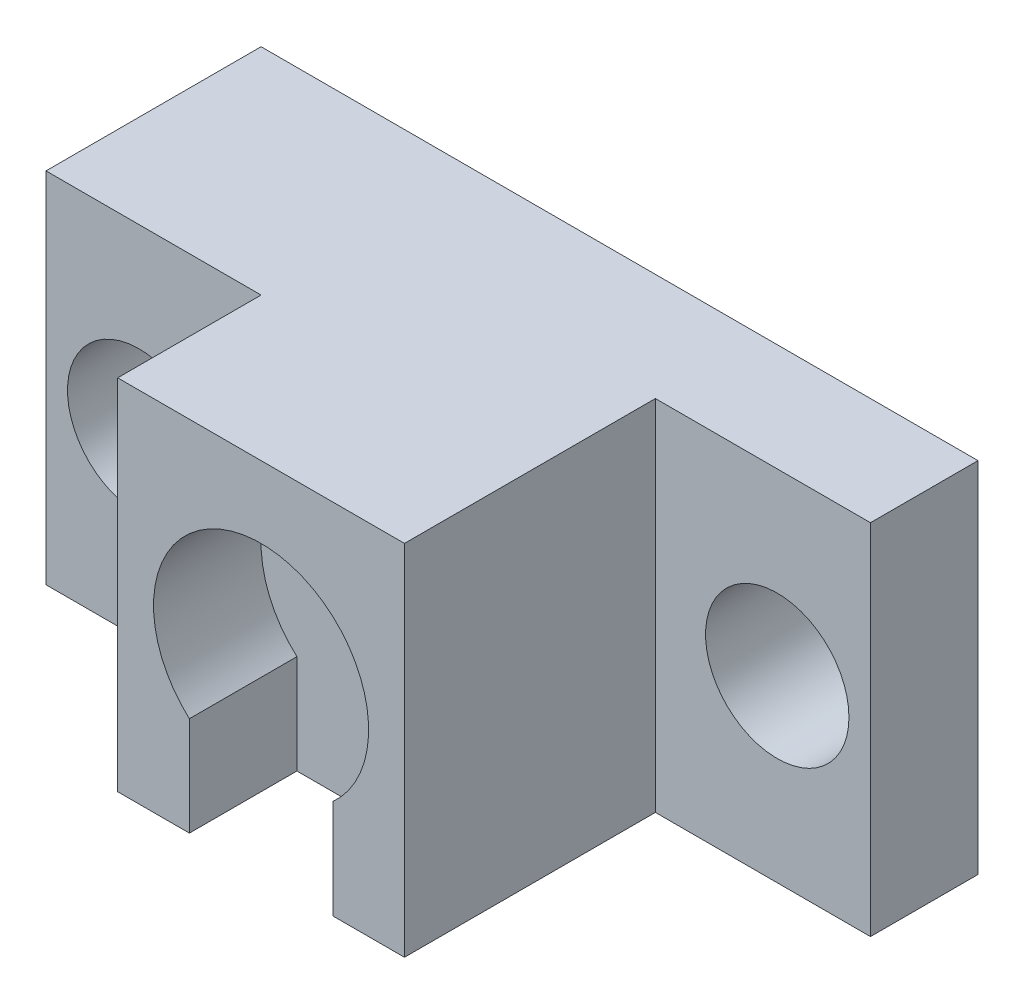
ISO-10303-21;
HEADER;
FILE_DESCRIPTION(('STEP AP214'),'2;1');
FILE_NAME('part.step','',(''),(''),'','','');
FILE_SCHEMA(('AUTOMOTIVE_DESIGN { 1 0 10303 214 1 1 1 1 }'));
ENDSEC;
DATA;
#1=APPLICATION_CONTEXT('core data for automotive mechanical design processes');
#2=APPLICATION_PROTOCOL_DEFINITION('international standard','automotive_design',2000,#1);
#3=PRODUCT_CONTEXT('',#1,'mechanical');
#4=PRODUCT('Part','Part','',(#3));
#5=PRODUCT_RELATED_PRODUCT_CATEGORY('part','',(#4));
#6=PRODUCT_DEFINITION_FORMATION('','',#4);
#7=PRODUCT_DEFINITION_CONTEXT('part definition',#1,'design');
#8=PRODUCT_DEFINITION('design','',#6,#7);
#9=PRODUCT_DEFINITION_SHAPE('','',#8);
#10=(LENGTH_UNIT() NAMED_UNIT(*) SI_UNIT(.MILLI.,.METRE.));
#11=(NAMED_UNIT(*) PLANE_ANGLE_UNIT() SI_UNIT($,.RADIAN.));
#12=(NAMED_UNIT(*) SI_UNIT($,.STERADIAN.) SOLID_ANGLE_UNIT());
#13=UNCERTAINTY_MEASURE_WITH_UNIT(LENGTH_MEASURE(1.E-05),#10,'distance_accuracy_value','');
#14=(GEOMETRIC_REPRESENTATION_CONTEXT(3) GLOBAL_UNCERTAINTY_ASSIGNED_CONTEXT((#13)) GLOBAL_UNIT_ASSIGNED_CONTEXT((#10,
#11,#12)) REPRESENTATION_CONTEXT('',''));
#15=CARTESIAN_POINT('',(0.,0.,0.));
#16=DIRECTION('',(0.,0.,1.));
#17=DIRECTION('',(1.,0.,0.));
#18=AXIS2_PLACEMENT_3D('',#15,#16,#17);
#19=CARTESIAN_POINT('',(0.,9.3607305936073,50.));
#20=DIRECTION('',(0.,1.,0.));
#21=DIRECTION('',(0.,0.,1.));
#22=AXIS2_PLACEMENT_3D('',#19,#20,#21);
#23=PLANE('',#22);
#24=DIRECTION('',(0.,0.,1.));
#25=VECTOR('',#24,1.);
#26=CARTESIAN_POINT('',(10.,9.36073059360731,35.));
#27=LINE('',#26,#25);
#28=CARTESIAN_POINT('',(10.,9.36073059360731,35.));
#29=VERTEX_POINT('',#28);
#30=CARTESIAN_POINT('',(10.,9.36073059360731,50.));
#31=VERTEX_POINT('',#30);
#32=EDGE_CURVE('E128',#29,#31,#27,.T.);
#33=ORIENTED_EDGE('',*,*,#32,.F.);
#34=DIRECTION('',(1.,0.,0.));
#35=VECTOR('',#34,1.);
#36=CARTESIAN_POINT('',(-10.,9.3607305936073,35.));
#37=LINE('',#36,#35);
#38=CARTESIAN_POINT('',(-10.,9.3607305936073,35.));
#39=VERTEX_POINT('',#38);
#40=EDGE_CURVE('E133',#39,#29,#37,.T.);
#41=ORIENTED_EDGE('',*,*,#40,.F.);
#42=DIRECTION('',(0.,0.,1.));
#43=VECTOR('',#42,1.);
#44=CARTESIAN_POINT('',(-10.,9.3607305936073,35.));
#45=LINE('',#44,#43);
#46=CARTESIAN_POINT('',(-10.,9.3607305936073,50.));
#47=VERTEX_POINT('',#46);
#48=EDGE_CURVE('E148',#39,#47,#45,.T.);
#49=ORIENTED_EDGE('',*,*,#48,.T.);
#50=DIRECTION('',(1.,0.,0.));
#51=VECTOR('',#50,1.);
#52=CARTESIAN_POINT('',(0.,9.3607305936073,50.));
#53=LINE('',#52,#51);
#54=CARTESIAN_POINT('',(-20.,9.3607305936073,50.));
#55=VERTEX_POINT('',#54);
#56=EDGE_CURVE('E190',#55,#47,#53,.T.);
#57=ORIENTED_EDGE('',*,*,#56,.F.);
#58=DIRECTION('',(0.,0.,-1.));
#59=VECTOR('',#58,1.);
#60=CARTESIAN_POINT('',(-20.,9.3607305936073,50.));
#61=LINE('',#60,#59);
#62=CARTESIAN_POINT('',(-20.,9.3607305936073,30.));
#63=VERTEX_POINT('',#62);
#64=EDGE_CURVE('E200',#55,#63,#61,.T.);
#65=ORIENTED_EDGE('',*,*,#64,.T.);
#66=DIRECTION('',(1.,0.,0.));
#67=VECTOR('',#66,1.);
#68=CARTESIAN_POINT('',(0.,9.3607305936073,30.));
#69=LINE('',#68,#67);
#70=CARTESIAN_POINT('',(-50.,9.3607305936073,30.));
#71=VERTEX_POINT('',#70);
#72=EDGE_CURVE('E179',#71,#63,#69,.T.);
#73=ORIENTED_EDGE('',*,*,#72,.F.);
#74=DIRECTION('',(0.,0.,-1.));
#75=VECTOR('',#74,1.);
#76=CARTESIAN_POINT('',(-50.,9.3607305936073,30.));
#77=LINE('',#76,#75);
#78=CARTESIAN_POINT('',(-50.,9.3607305936073,0.));
#79=VERTEX_POINT('',#78);
#80=EDGE_CURVE('E181',#71,#79,#77,.T.);
#81=ORIENTED_EDGE('',*,*,#80,.T.);
#82=DIRECTION('',(1.,0.,0.));
#83=VECTOR('',#82,1.);
#84=CARTESIAN_POINT('',(0.,9.3607305936073,0.));
#85=LINE('',#84,#83);
#86=CARTESIAN_POINT('',(50.,9.3607305936073,0.));
#87=VERTEX_POINT('',#86);
#88=EDGE_CURVE('E189',#79,#87,#85,.T.);
#89=ORIENTED_EDGE('',*,*,#88,.T.);
#90=DIRECTION('',(0.,0.,-1.));
#91=VECTOR('',#90,1.);
#92=CARTESIAN_POINT('',(50.,9.3607305936073,15.));
#93=LINE('',#92,#91);
#94=CARTESIAN_POINT('',(50.,9.3607305936073,15.));
#95=VERTEX_POINT('',#94);
#96=EDGE_CURVE('E167',#95,#87,#93,.T.);
#97=ORIENTED_EDGE('',*,*,#96,.F.);
#98=DIRECTION('',(1.,0.,0.));
#99=VECTOR('',#98,1.);
#100=CARTESIAN_POINT('',(0.,9.3607305936073,15.));
#101=LINE('',#100,#99);
#102=CARTESIAN_POINT('',(20.,9.3607305936073,15.));
#103=VERTEX_POINT('',#102);
#104=EDGE_CURVE('E158',#103,#95,#101,.T.);
#105=ORIENTED_EDGE('',*,*,#104,.F.);
#106=DIRECTION('',(0.,0.,-1.));
#107=VECTOR('',#106,1.);
#108=CARTESIAN_POINT('',(20.,9.3607305936073,50.));
#109=LINE('',#108,#107);
#110=CARTESIAN_POINT('',(20.,9.3607305936073,50.));
#111=VERTEX_POINT('',#110);
#112=EDGE_CURVE('E11',#111,#103,#109,.T.);
#113=ORIENTED_EDGE('',*,*,#112,.F.);
#114=EDGE_CURVE('E146',#31,#111,#53,.T.);
#115=ORIENTED_EDGE('',*,*,#114,.F.);
#116=EDGE_LOOP('',(#33,#41,#49,#57,#65,#73,#81,#89,#97,#105,#113,#115));
#117=FACE_BOUND('',#116,.T.);
#118=ADVANCED_FACE('F35',(#117),#23,.F.);
#119=CARTESIAN_POINT('',(0.,0.,50.));
#120=DIRECTION('',(0.,0.,1.));
#121=DIRECTION('',(1.,0.,0.));
#122=AXIS2_PLACEMENT_3D('',#119,#120,#121);
#123=PLANE('',#122);
#124=CARTESIAN_POINT('',(0.,34.3607305936073,50.));
#125=DIRECTION('',(0.,0.,1.));
#126=DIRECTION('',(1.,0.,0.));
#127=AXIS2_PLACEMENT_3D('',#124,#125,#126);
#128=CIRCLE('',#127,15.);
#129=CARTESIAN_POINT('',(9.99999999999999,23.1803907061084,50.));
#130=VERTEX_POINT('',#129);
#131=CARTESIAN_POINT('',(-10.,23.1803907061084,50.));
#132=VERTEX_POINT('',#131);
#133=EDGE_CURVE('E134',#130,#132,#128,.T.);
#134=ORIENTED_EDGE('',*,*,#133,.F.);
#135=DIRECTION('',(0.,-1.,0.));
#136=VECTOR('',#135,1.);
#137=CARTESIAN_POINT('',(10.,23.1803907061084,50.));
#138=LINE('',#137,#136);
#139=EDGE_CURVE('E50',#130,#31,#138,.T.);
#140=ORIENTED_EDGE('',*,*,#139,.T.);
#141=ORIENTED_EDGE('',*,*,#114,.T.);
#142=DIRECTION('',(0.,1.,0.));
#143=VECTOR('',#142,1.);
#144=CARTESIAN_POINT('',(20.,0.,50.));
#145=LINE('',#144,#143);
#146=CARTESIAN_POINT('',(20.,59.3607305936073,50.));
#147=VERTEX_POINT('',#146);
#148=EDGE_CURVE('E193',#111,#147,#145,.T.);
#149=ORIENTED_EDGE('',*,*,#148,.T.);
#150=DIRECTION('',(1.,0.,0.));
#151=VECTOR('',#150,1.);
#152=CARTESIAN_POINT('',(0.,59.3607305936073,50.));
#153=LINE('',#152,#151);
#154=CARTESIAN_POINT('',(-20.,59.3607305936073,50.));
#155=VERTEX_POINT('',#154);
#156=EDGE_CURVE('E195',#155,#147,#153,.T.);
#157=ORIENTED_EDGE('',*,*,#156,.F.);
#158=DIRECTION('',(0.,-1.,0.));
#159=VECTOR('',#158,1.);
#160=CARTESIAN_POINT('',(-20.,0.,50.));
#161=LINE('',#160,#159);
#162=EDGE_CURVE('E198',#155,#55,#161,.T.);
#163=ORIENTED_EDGE('',*,*,#162,.T.);
#164=ORIENTED_EDGE('',*,*,#56,.T.);
#165=DIRECTION('',(0.,-1.,0.));
#166=VECTOR('',#165,1.);
#167=CARTESIAN_POINT('',(-10.,23.1803907061084,50.));
#168=LINE('',#167,#166);
#169=EDGE_CURVE('E301',#132,#47,#168,.T.);
#170=ORIENTED_EDGE('',*,*,#169,.F.);
#171=EDGE_LOOP('',(#134,#140,#141,#149,#157,#163,#164,#170));
#172=FACE_BOUND('',#171,.T.);
#173=ADVANCED_FACE('F246',(#172),#123,.T.);
#174=CARTESIAN_POINT('',(20.,0.,50.));
#175=DIRECTION('',(-1.,0.,0.));
#176=DIRECTION('',(0.,0.,1.));
#177=AXIS2_PLACEMENT_3D('',#174,#175,#176);
#178=PLANE('',#177);
#179=ORIENTED_EDGE('',*,*,#112,.T.);
#180=DIRECTION('',(0.,1.,0.));
#181=VECTOR('',#180,1.);
#182=CARTESIAN_POINT('',(20.,0.,15.));
#183=LINE('',#182,#181);
#184=CARTESIAN_POINT('',(20.,59.3607305936073,15.));
#185=VERTEX_POINT('',#184);
#186=EDGE_CURVE('E151',#103,#185,#183,.T.);
#187=ORIENTED_EDGE('',*,*,#186,.T.);
#188=DIRECTION('',(0.,0.,-1.));
#189=VECTOR('',#188,1.);
#190=CARTESIAN_POINT('',(20.,59.3607305936073,50.));
#191=LINE('',#190,#189);
#192=EDGE_CURVE('E43',#147,#185,#191,.T.);
#193=ORIENTED_EDGE('',*,*,#192,.F.);
#194=ORIENTED_EDGE('',*,*,#148,.F.);
#195=EDGE_LOOP('',(#179,#187,#193,#194));
#196=FACE_BOUND('',#195,.T.);
#197=ADVANCED_FACE('F216',(#196),#178,.F.);
#198=CARTESIAN_POINT('',(0.,59.3607305936073,50.));
#199=DIRECTION('',(0.,1.,0.));
#200=DIRECTION('',(0.,0.,1.));
#201=AXIS2_PLACEMENT_3D('',#198,#199,#200);
#202=PLANE('',#201);
#203=DIRECTION('',(1.,0.,0.));
#204=VECTOR('',#203,1.);
#205=CARTESIAN_POINT('',(0.,59.3607305936073,0.));
#206=LINE('',#205,#204);
#207=CARTESIAN_POINT('',(-50.,59.3607305936073,0.));
#208=VERTEX_POINT('',#207);
#209=CARTESIAN_POINT('',(50.,59.3607305936073,0.));
#210=VERTEX_POINT('',#209);
#211=EDGE_CURVE('E202',#208,#210,#206,.T.);
#212=ORIENTED_EDGE('',*,*,#211,.F.);
#213=DIRECTION('',(0.,0.,-1.));
#214=VECTOR('',#213,1.);
#215=CARTESIAN_POINT('',(-50.,59.3607305936073,30.));
#216=LINE('',#215,#214);
#217=CARTESIAN_POINT('',(-50.,59.3607305936073,30.));
#218=VERTEX_POINT('',#217);
#219=EDGE_CURVE('E186',#218,#208,#216,.T.);
#220=ORIENTED_EDGE('',*,*,#219,.F.);
#221=DIRECTION('',(1.,0.,0.));
#222=VECTOR('',#221,1.);
#223=CARTESIAN_POINT('',(0.,59.3607305936073,30.));
#224=LINE('',#223,#222);
#225=CARTESIAN_POINT('',(-20.,59.3607305936073,30.));
#226=VERTEX_POINT('',#225);
#227=EDGE_CURVE('E174',#218,#226,#224,.T.);
#228=ORIENTED_EDGE('',*,*,#227,.T.);
#229=DIRECTION('',(0.,0.,-1.));
#230=VECTOR('',#229,1.);
#231=CARTESIAN_POINT('',(-20.,59.3607305936073,50.));
#232=LINE('',#231,#230);
#233=EDGE_CURVE('E206',#155,#226,#232,.T.);
#234=ORIENTED_EDGE('',*,*,#233,.F.);
#235=ORIENTED_EDGE('',*,*,#156,.T.);
#236=ORIENTED_EDGE('',*,*,#192,.T.);
#237=DIRECTION('',(1.,0.,0.));
#238=VECTOR('',#237,1.);
#239=CARTESIAN_POINT('',(0.,59.3607305936073,15.));
#240=LINE('',#239,#238);
#241=CARTESIAN_POINT('',(50.,59.3607305936073,15.));
#242=VERTEX_POINT('',#241);
#243=EDGE_CURVE('E58',#185,#242,#240,.T.);
#244=ORIENTED_EDGE('',*,*,#243,.T.);
#245=DIRECTION('',(0.,0.,-1.));
#246=VECTOR('',#245,1.);
#247=CARTESIAN_POINT('',(50.,59.3607305936073,15.));
#248=LINE('',#247,#246);
#249=EDGE_CURVE('E163',#242,#210,#248,.T.);
#250=ORIENTED_EDGE('',*,*,#249,.T.);
#251=EDGE_LOOP('',(#212,#220,#228,#234,#235,#236,#244,#250));
#252=FACE_BOUND('',#251,.T.);
#253=ADVANCED_FACE('F212',(#252),#202,.T.);
#254=CARTESIAN_POINT('',(-20.,0.,50.));
#255=DIRECTION('',(1.,0.,0.));
#256=DIRECTION('',(0.,1.,0.));
#257=AXIS2_PLACEMENT_3D('',#254,#255,#256);
#258=PLANE('',#257);
#259=ORIENTED_EDGE('',*,*,#233,.T.);
#260=DIRECTION('',(0.,-1.,0.));
#261=VECTOR('',#260,1.);
#262=CARTESIAN_POINT('',(-20.,0.,30.));
#263=LINE('',#262,#261);
#264=EDGE_CURVE('E171',#226,#63,#263,.T.);
#265=ORIENTED_EDGE('',*,*,#264,.T.);
#266=ORIENTED_EDGE('',*,*,#64,.F.);
#267=ORIENTED_EDGE('',*,*,#162,.F.);
#268=EDGE_LOOP('',(#259,#265,#266,#267));
#269=FACE_BOUND('',#268,.T.);
#270=ADVANCED_FACE('F231',(#269),#258,.F.);
#271=CARTESIAN_POINT('',(0.,0.,0.));
#272=DIRECTION('',(0.,0.,1.));
#273=DIRECTION('',(1.,0.,0.));
#274=AXIS2_PLACEMENT_3D('',#271,#272,#273);
#275=PLANE('',#274);
#276=CARTESIAN_POINT('',(-37.,34.3607305936073,0.));
#277=DIRECTION('',(0.,0.,1.));
#278=DIRECTION('',(1.,0.,0.));
#279=AXIS2_PLACEMENT_3D('',#276,#277,#278);
#280=CIRCLE('',#279,10.);
#281=CARTESIAN_POINT('',(-27.,34.3607305936073,0.));
#282=VERTEX_POINT('',#281);
#283=EDGE_CURVE('E287',#282,#282,#280,.T.);
#284=ORIENTED_EDGE('',*,*,#283,.T.);
#285=EDGE_LOOP('',(#284));
#286=FACE_BOUND('',#285,.T.);
#287=CARTESIAN_POINT('',(37.,34.3607305936073,0.));
#288=DIRECTION('',(0.,0.,1.));
#289=DIRECTION('',(1.,0.,0.));
#290=AXIS2_PLACEMENT_3D('',#287,#288,#289);
#291=CIRCLE('',#290,10.);
#292=CARTESIAN_POINT('',(47.,34.3607305936073,0.));
#293=VERTEX_POINT('',#292);
#294=EDGE_CURVE('E291',#293,#293,#291,.T.);
#295=ORIENTED_EDGE('',*,*,#294,.T.);
#296=EDGE_LOOP('',(#295));
#297=FACE_BOUND('',#296,.T.);
#298=ORIENTED_EDGE('',*,*,#88,.F.);
#299=DIRECTION('',(0.,-1.,0.));
#300=VECTOR('',#299,1.);
#301=CARTESIAN_POINT('',(-50.,0.,0.));
#302=LINE('',#301,#300);
#303=EDGE_CURVE('E170',#208,#79,#302,.T.);
#304=ORIENTED_EDGE('',*,*,#303,.F.);
#305=ORIENTED_EDGE('',*,*,#211,.T.);
#306=DIRECTION('',(0.,-1.,0.));
#307=VECTOR('',#306,1.);
#308=CARTESIAN_POINT('',(50.,0.,0.));
#309=LINE('',#308,#307);
#310=EDGE_CURVE('E147',#210,#87,#309,.T.);
#311=ORIENTED_EDGE('',*,*,#310,.T.);
#312=EDGE_LOOP('',(#298,#304,#305,#311));
#313=FACE_BOUND('',#312,.T.);
#314=ADVANCED_FACE('F229',(#286,#297,#313),#275,.F.);
#315=CARTESIAN_POINT('',(-50.,0.,30.));
#316=DIRECTION('',(1.,0.,0.));
#317=DIRECTION('',(0.,0.,-1.));
#318=AXIS2_PLACEMENT_3D('',#315,#316,#317);
#319=PLANE('',#318);
#320=ORIENTED_EDGE('',*,*,#303,.T.);
#321=ORIENTED_EDGE('',*,*,#80,.F.);
#322=DIRECTION('',(0.,-1.,0.));
#323=VECTOR('',#322,1.);
#324=CARTESIAN_POINT('',(-50.,0.,30.));
#325=LINE('',#324,#323);
#326=EDGE_CURVE('E177',#218,#71,#325,.T.);
#327=ORIENTED_EDGE('',*,*,#326,.F.);
#328=ORIENTED_EDGE('',*,*,#219,.T.);
#329=EDGE_LOOP('',(#320,#321,#327,#328));
#330=FACE_BOUND('',#329,.T.);
#331=ADVANCED_FACE('F226',(#330),#319,.F.);
#332=CARTESIAN_POINT('',(0.,0.,30.));
#333=DIRECTION('',(0.,0.,1.));
#334=DIRECTION('',(1.,0.,0.));
#335=AXIS2_PLACEMENT_3D('',#332,#333,#334);
#336=PLANE('',#335);
#337=CARTESIAN_POINT('',(-37.,34.3607305936073,30.));
#338=DIRECTION('',(0.,0.,1.));
#339=DIRECTION('',(1.,0.,0.));
#340=AXIS2_PLACEMENT_3D('',#337,#338,#339);
#341=CIRCLE('',#340,10.);
#342=CARTESIAN_POINT('',(-27.,34.3607305936073,30.));
#343=VERTEX_POINT('',#342);
#344=EDGE_CURVE('E290',#343,#343,#341,.T.);
#345=ORIENTED_EDGE('',*,*,#344,.F.);
#346=EDGE_LOOP('',(#345));
#347=FACE_BOUND('',#346,.T.);
#348=ORIENTED_EDGE('',*,*,#264,.F.);
#349=ORIENTED_EDGE('',*,*,#227,.F.);
#350=ORIENTED_EDGE('',*,*,#326,.T.);
#351=ORIENTED_EDGE('',*,*,#72,.T.);
#352=EDGE_LOOP('',(#348,#349,#350,#351));
#353=FACE_BOUND('',#352,.T.);
#354=ADVANCED_FACE('F238',(#347,#353),#336,.T.);
#355=CARTESIAN_POINT('',(50.,0.,15.));
#356=DIRECTION('',(1.,0.,0.));
#357=DIRECTION('',(0.,0.,-1.));
#358=AXIS2_PLACEMENT_3D('',#355,#356,#357);
#359=PLANE('',#358);
#360=ORIENTED_EDGE('',*,*,#310,.F.);
#361=ORIENTED_EDGE('',*,*,#249,.F.);
#362=DIRECTION('',(0.,-1.,0.));
#363=VECTOR('',#362,1.);
#364=CARTESIAN_POINT('',(50.,0.,15.));
#365=LINE('',#364,#363);
#366=EDGE_CURVE('E160',#242,#95,#365,.T.);
#367=ORIENTED_EDGE('',*,*,#366,.T.);
#368=ORIENTED_EDGE('',*,*,#96,.T.);
#369=EDGE_LOOP('',(#360,#361,#367,#368));
#370=FACE_BOUND('',#369,.T.);
#371=ADVANCED_FACE('F221',(#370),#359,.T.);
#372=CARTESIAN_POINT('',(0.,0.,15.));
#373=DIRECTION('',(0.,0.,1.));
#374=DIRECTION('',(1.,0.,0.));
#375=AXIS2_PLACEMENT_3D('',#372,#373,#374);
#376=PLANE('',#375);
#377=CARTESIAN_POINT('',(37.,34.3607305936073,15.));
#378=DIRECTION('',(0.,0.,1.));
#379=DIRECTION('',(1.,0.,0.));
#380=AXIS2_PLACEMENT_3D('',#377,#378,#379);
#381=CIRCLE('',#380,10.);
#382=CARTESIAN_POINT('',(47.,34.3607305936073,15.));
#383=VERTEX_POINT('',#382);
#384=EDGE_CURVE('E38',#383,#383,#381,.T.);
#385=ORIENTED_EDGE('',*,*,#384,.F.);
#386=EDGE_LOOP('',(#385));
#387=FACE_BOUND('',#386,.T.);
#388=ORIENTED_EDGE('',*,*,#186,.F.);
#389=ORIENTED_EDGE('',*,*,#104,.T.);
#390=ORIENTED_EDGE('',*,*,#366,.F.);
#391=ORIENTED_EDGE('',*,*,#243,.F.);
#392=EDGE_LOOP('',(#388,#389,#390,#391));
#393=FACE_BOUND('',#392,.T.);
#394=ADVANCED_FACE('F217',(#387,#393),#376,.T.);
#395=CARTESIAN_POINT('',(10.,23.1803907061084,35.));
#396=DIRECTION('',(-1.,0.,0.));
#397=DIRECTION('',(0.,-1.,0.));
#398=AXIS2_PLACEMENT_3D('',#395,#396,#397);
#399=PLANE('',#398);
#400=ORIENTED_EDGE('',*,*,#139,.F.);
#401=DIRECTION('',(0.,0.,1.));
#402=VECTOR('',#401,1.);
#403=CARTESIAN_POINT('',(9.99999999999999,23.1803907061084,35.));
#404=LINE('',#403,#402);
#405=CARTESIAN_POINT('',(9.99999999999999,23.1803907061084,35.));
#406=VERTEX_POINT('',#405);
#407=EDGE_CURVE('E129',#406,#130,#404,.T.);
#408=ORIENTED_EDGE('',*,*,#407,.F.);
#409=DIRECTION('',(0.,-1.,0.));
#410=VECTOR('',#409,1.);
#411=CARTESIAN_POINT('',(10.,23.1803907061084,35.));
#412=LINE('',#411,#410);
#413=EDGE_CURVE('E124',#406,#29,#412,.T.);
#414=ORIENTED_EDGE('',*,*,#413,.T.);
#415=ORIENTED_EDGE('',*,*,#32,.T.);
#416=EDGE_LOOP('',(#400,#408,#414,#415));
#417=FACE_BOUND('',#416,.T.);
#418=ADVANCED_FACE('F126',(#417),#399,.T.);
#419=CARTESIAN_POINT('',(-10.,23.1803907061084,35.));
#420=DIRECTION('',(-1.,0.,0.));
#421=DIRECTION('',(0.,-1.,0.));
#422=AXIS2_PLACEMENT_3D('',#419,#420,#421);
#423=PLANE('',#422);
#424=ORIENTED_EDGE('',*,*,#169,.T.);
#425=ORIENTED_EDGE('',*,*,#48,.F.);
#426=DIRECTION('',(0.,-1.,0.));
#427=VECTOR('',#426,1.);
#428=CARTESIAN_POINT('',(-10.,23.1803907061084,35.));
#429=LINE('',#428,#427);
#430=CARTESIAN_POINT('',(-10.,23.1803907061084,35.));
#431=VERTEX_POINT('',#430);
#432=EDGE_CURVE('E140',#431,#39,#429,.T.);
#433=ORIENTED_EDGE('',*,*,#432,.F.);
#434=DIRECTION('',(0.,0.,1.));
#435=VECTOR('',#434,1.);
#436=CARTESIAN_POINT('',(-10.,23.1803907061084,35.));
#437=LINE('',#436,#435);
#438=EDGE_CURVE('E153',#431,#132,#437,.T.);
#439=ORIENTED_EDGE('',*,*,#438,.T.);
#440=EDGE_LOOP('',(#424,#425,#433,#439));
#441=FACE_BOUND('',#440,.T.);
#442=ADVANCED_FACE('F266',(#441),#423,.F.);
#443=CARTESIAN_POINT('',(0.,34.3607305936073,35.));
#444=DIRECTION('',(0.,0.,1.));
#445=DIRECTION('',(1.,0.,0.));
#446=AXIS2_PLACEMENT_3D('',#443,#444,#445);
#447=CYLINDRICAL_SURFACE('',#446,15.);
#448=ORIENTED_EDGE('',*,*,#133,.T.);
#449=ORIENTED_EDGE('',*,*,#438,.F.);
#450=CARTESIAN_POINT('',(0.,34.3607305936073,35.));
#451=DIRECTION('',(0.,0.,1.));
#452=DIRECTION('',(1.,0.,0.));
#453=AXIS2_PLACEMENT_3D('',#450,#451,#452);
#454=CIRCLE('',#453,15.);
#455=EDGE_CURVE('E298',#406,#431,#454,.T.);
#456=ORIENTED_EDGE('',*,*,#455,.F.);
#457=ORIENTED_EDGE('',*,*,#407,.T.);
#458=EDGE_LOOP('',(#448,#449,#456,#457));
#459=FACE_BOUND('',#458,.T.);
#460=ADVANCED_FACE('F269',(#459),#447,.F.);
#461=CARTESIAN_POINT('',(0.,34.3607305936073,35.));
#462=DIRECTION('',(0.,0.,1.));
#463=DIRECTION('',(1.,0.,0.));
#464=AXIS2_PLACEMENT_3D('',#461,#462,#463);
#465=PLANE('',#464);
#466=ORIENTED_EDGE('',*,*,#413,.F.);
#467=ORIENTED_EDGE('',*,*,#455,.T.);
#468=ORIENTED_EDGE('',*,*,#432,.T.);
#469=ORIENTED_EDGE('',*,*,#40,.T.);
#470=EDGE_LOOP('',(#466,#467,#468,#469));
#471=FACE_BOUND('',#470,.T.);
#472=ADVANCED_FACE('F138',(#471),#465,.T.);
#473=CARTESIAN_POINT('',(37.,34.3607305936073,0.));
#474=DIRECTION('',(0.,0.,1.));
#475=DIRECTION('',(1.,0.,0.));
#476=AXIS2_PLACEMENT_3D('',#473,#474,#475);
#477=CYLINDRICAL_SURFACE('',#476,10.);
#478=ORIENTED_EDGE('',*,*,#384,.T.);
#479=EDGE_LOOP('',(#478));
#480=FACE_BOUND('',#479,.T.);
#481=ORIENTED_EDGE('',*,*,#294,.F.);
#482=EDGE_LOOP('',(#481));
#483=FACE_BOUND('',#482,.T.);
#484=ADVANCED_FACE('F276',(#480,#483),#477,.F.);
#485=CARTESIAN_POINT('',(-37.,34.3607305936073,0.));
#486=DIRECTION('',(0.,0.,1.));
#487=DIRECTION('',(1.,0.,0.));
#488=AXIS2_PLACEMENT_3D('',#485,#486,#487);
#489=CYLINDRICAL_SURFACE('',#488,10.);
#490=ORIENTED_EDGE('',*,*,#283,.F.);
#491=EDGE_LOOP('',(#490));
#492=FACE_BOUND('',#491,.T.);
#493=ORIENTED_EDGE('',*,*,#344,.T.);
#494=EDGE_LOOP('',(#493));
#495=FACE_BOUND('',#494,.T.);
#496=ADVANCED_FACE('F279',(#492,#495),#489,.F.);
#497=CLOSED_SHELL('',(#118,#173,#197,#253,#270,#314,#331,#354,#371,#394,#418,#442,#460,#472,
#484,#496));
#498=MANIFOLD_SOLID_BREP('B2',#497);
#499=ADVANCED_BREP_SHAPE_REPRESENTATION('',(#18,#498),#14);
#500=SHAPE_DEFINITION_REPRESENTATION(#9,#499);
ENDSEC;
END-ISO-10303-21;
